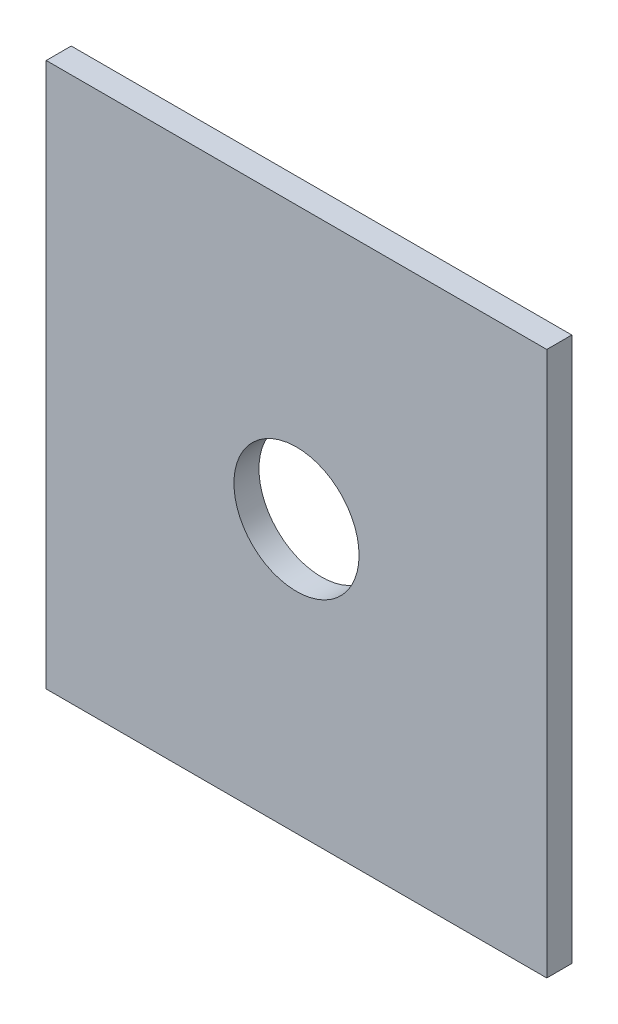
ISO-10303-21;
HEADER;
FILE_DESCRIPTION(('STEP AP214'),'2;1');
FILE_NAME('part.step','',(''),(''),'','','');
FILE_SCHEMA(('AUTOMOTIVE_DESIGN { 1 0 10303 214 1 1 1 1 }'));
ENDSEC;
DATA;
#1=APPLICATION_CONTEXT('core data for automotive mechanical design processes');
#2=APPLICATION_PROTOCOL_DEFINITION('international standard','automotive_design',2000,#1);
#3=PRODUCT_CONTEXT('',#1,'mechanical');
#4=PRODUCT('Part','Part','',(#3));
#5=PRODUCT_RELATED_PRODUCT_CATEGORY('part','',(#4));
#6=PRODUCT_DEFINITION_FORMATION('','',#4);
#7=PRODUCT_DEFINITION_CONTEXT('part definition',#1,'design');
#8=PRODUCT_DEFINITION('design','',#6,#7);
#9=PRODUCT_DEFINITION_SHAPE('','',#8);
#10=(LENGTH_UNIT() NAMED_UNIT(*) SI_UNIT(.MILLI.,.METRE.));
#11=(NAMED_UNIT(*) PLANE_ANGLE_UNIT() SI_UNIT($,.RADIAN.));
#12=(NAMED_UNIT(*) SI_UNIT($,.STERADIAN.) SOLID_ANGLE_UNIT());
#13=UNCERTAINTY_MEASURE_WITH_UNIT(LENGTH_MEASURE(1.E-05),#10,'distance_accuracy_value','');
#14=(GEOMETRIC_REPRESENTATION_CONTEXT(3) GLOBAL_UNCERTAINTY_ASSIGNED_CONTEXT((#13)) GLOBAL_UNIT_ASSIGNED_CONTEXT((#10,
#11,#12)) REPRESENTATION_CONTEXT('',''));
#15=CARTESIAN_POINT('',(0.,0.,0.));
#16=DIRECTION('',(0.,0.,1.));
#17=DIRECTION('',(1.,0.,0.));
#18=AXIS2_PLACEMENT_3D('',#15,#16,#17);
#19=CARTESIAN_POINT('',(0.,0.,2.));
#20=DIRECTION('',(1.,0.,0.));
#21=DIRECTION('',(0.,1.,0.));
#22=AXIS2_PLACEMENT_3D('',#19,#20,#21);
#23=PLANE('',#22);
#24=DIRECTION('',(0.,-1.,0.));
#25=VECTOR('',#24,1.);
#26=CARTESIAN_POINT('',(0.,0.,0.));
#27=LINE('',#26,#25);
#28=CARTESIAN_POINT('',(0.,0.,0.));
#29=VERTEX_POINT('',#28);
#30=CARTESIAN_POINT('',(0.,-43.5,0.));
#31=VERTEX_POINT('',#30);
#32=EDGE_CURVE('E101',#29,#31,#27,.T.);
#33=ORIENTED_EDGE('',*,*,#32,.T.);
#34=DIRECTION('',(0.,0.,-1.));
#35=VECTOR('',#34,1.);
#36=CARTESIAN_POINT('',(0.,-43.5,2.));
#37=LINE('',#36,#35);
#38=CARTESIAN_POINT('',(0.,-43.5,2.));
#39=VERTEX_POINT('',#38);
#40=EDGE_CURVE('E11',#39,#31,#37,.T.);
#41=ORIENTED_EDGE('',*,*,#40,.F.);
#42=DIRECTION('',(0.,-1.,0.));
#43=VECTOR('',#42,1.);
#44=CARTESIAN_POINT('',(0.,0.,2.));
#45=LINE('',#44,#43);
#46=CARTESIAN_POINT('',(0.,0.,2.));
#47=VERTEX_POINT('',#46);
#48=EDGE_CURVE('E89',#47,#39,#45,.T.);
#49=ORIENTED_EDGE('',*,*,#48,.F.);
#50=DIRECTION('',(0.,0.,-1.));
#51=VECTOR('',#50,1.);
#52=CARTESIAN_POINT('',(0.,0.,2.));
#53=LINE('',#52,#51);
#54=EDGE_CURVE('E97',#47,#29,#53,.T.);
#55=ORIENTED_EDGE('',*,*,#54,.T.);
#56=EDGE_LOOP('',(#33,#41,#49,#55));
#57=FACE_BOUND('',#56,.T.);
#58=ADVANCED_FACE('F38',(#57),#23,.F.);
#59=CARTESIAN_POINT('',(0.,-43.5,2.));
#60=DIRECTION('',(0.,1.,0.));
#61=DIRECTION('',(0.,0.,1.));
#62=AXIS2_PLACEMENT_3D('',#59,#60,#61);
#63=PLANE('',#62);
#64=DIRECTION('',(1.,0.,0.));
#65=VECTOR('',#64,1.);
#66=CARTESIAN_POINT('',(0.,-43.5,0.));
#67=LINE('',#66,#65);
#68=CARTESIAN_POINT('',(40.,-43.5,0.));
#69=VERTEX_POINT('',#68);
#70=EDGE_CURVE('E93',#31,#69,#67,.T.);
#71=ORIENTED_EDGE('',*,*,#70,.T.);
#72=DIRECTION('',(0.,0.,-1.));
#73=VECTOR('',#72,1.);
#74=CARTESIAN_POINT('',(40.,-43.5,2.));
#75=LINE('',#74,#73);
#76=CARTESIAN_POINT('',(40.,-43.5,2.));
#77=VERTEX_POINT('',#76);
#78=EDGE_CURVE('E46',#77,#69,#75,.T.);
#79=ORIENTED_EDGE('',*,*,#78,.F.);
#80=DIRECTION('',(1.,0.,0.));
#81=VECTOR('',#80,1.);
#82=CARTESIAN_POINT('',(0.,-43.5,2.));
#83=LINE('',#82,#81);
#84=EDGE_CURVE('E84',#39,#77,#83,.T.);
#85=ORIENTED_EDGE('',*,*,#84,.F.);
#86=ORIENTED_EDGE('',*,*,#40,.T.);
#87=EDGE_LOOP('',(#71,#79,#85,#86));
#88=FACE_BOUND('',#87,.T.);
#89=ADVANCED_FACE('F92',(#88),#63,.F.);
#90=CARTESIAN_POINT('',(40.,0.,2.));
#91=DIRECTION('',(-1.,0.,0.));
#92=DIRECTION('',(0.,-1.,0.));
#93=AXIS2_PLACEMENT_3D('',#90,#91,#92);
#94=PLANE('',#93);
#95=DIRECTION('',(0.,1.,0.));
#96=VECTOR('',#95,1.);
#97=CARTESIAN_POINT('',(40.,0.,0.));
#98=LINE('',#97,#96);
#99=CARTESIAN_POINT('',(40.,0.,0.));
#100=VERTEX_POINT('',#99);
#101=EDGE_CURVE('E71',#69,#100,#98,.T.);
#102=ORIENTED_EDGE('',*,*,#101,.T.);
#103=DIRECTION('',(0.,0.,-1.));
#104=VECTOR('',#103,1.);
#105=CARTESIAN_POINT('',(40.,0.,2.));
#106=LINE('',#105,#104);
#107=CARTESIAN_POINT('',(40.,0.,2.));
#108=VERTEX_POINT('',#107);
#109=EDGE_CURVE('E94',#108,#100,#106,.T.);
#110=ORIENTED_EDGE('',*,*,#109,.F.);
#111=DIRECTION('',(0.,1.,0.));
#112=VECTOR('',#111,1.);
#113=CARTESIAN_POINT('',(40.,0.,2.));
#114=LINE('',#113,#112);
#115=EDGE_CURVE('E87',#77,#108,#114,.T.);
#116=ORIENTED_EDGE('',*,*,#115,.F.);
#117=ORIENTED_EDGE('',*,*,#78,.T.);
#118=EDGE_LOOP('',(#102,#110,#116,#117));
#119=FACE_BOUND('',#118,.T.);
#120=ADVANCED_FACE('F95',(#119),#94,.F.);
#121=CARTESIAN_POINT('',(0.,0.,2.));
#122=DIRECTION('',(0.,-1.,0.));
#123=DIRECTION('',(0.,0.,-1.));
#124=AXIS2_PLACEMENT_3D('',#121,#122,#123);
#125=PLANE('',#124);
#126=DIRECTION('',(-1.,0.,0.));
#127=VECTOR('',#126,1.);
#128=CARTESIAN_POINT('',(0.,0.,0.));
#129=LINE('',#128,#127);
#130=EDGE_CURVE('E77',#100,#29,#129,.T.);
#131=ORIENTED_EDGE('',*,*,#130,.T.);
#132=ORIENTED_EDGE('',*,*,#54,.F.);
#133=DIRECTION('',(-1.,0.,0.));
#134=VECTOR('',#133,1.);
#135=CARTESIAN_POINT('',(0.,0.,2.));
#136=LINE('',#135,#134);
#137=EDGE_CURVE('E54',#108,#47,#136,.T.);
#138=ORIENTED_EDGE('',*,*,#137,.F.);
#139=ORIENTED_EDGE('',*,*,#109,.T.);
#140=EDGE_LOOP('',(#131,#132,#138,#139));
#141=FACE_BOUND('',#140,.T.);
#142=ADVANCED_FACE('F109',(#141),#125,.F.);
#143=CARTESIAN_POINT('',(0.,0.,2.));
#144=DIRECTION('',(0.,0.,1.));
#145=DIRECTION('',(1.,0.,0.));
#146=AXIS2_PLACEMENT_3D('',#143,#144,#145);
#147=PLANE('',#146);
#148=CARTESIAN_POINT('',(20.,-21.75,2.));
#149=DIRECTION('',(0.,0.,1.));
#150=DIRECTION('',(1.,0.,0.));
#151=AXIS2_PLACEMENT_3D('',#148,#149,#150);
#152=CIRCLE('',#151,5.);
#153=CARTESIAN_POINT('',(25.,-21.75,2.));
#154=VERTEX_POINT('',#153);
#155=EDGE_CURVE('E115',#154,#154,#152,.T.);
#156=ORIENTED_EDGE('',*,*,#155,.F.);
#157=EDGE_LOOP('',(#156));
#158=FACE_BOUND('',#157,.T.);
#159=ORIENTED_EDGE('',*,*,#48,.T.);
#160=ORIENTED_EDGE('',*,*,#84,.T.);
#161=ORIENTED_EDGE('',*,*,#115,.T.);
#162=ORIENTED_EDGE('',*,*,#137,.T.);
#163=EDGE_LOOP('',(#159,#160,#161,#162));
#164=FACE_BOUND('',#163,.T.);
#165=ADVANCED_FACE('F85',(#158,#164),#147,.T.);
#166=CARTESIAN_POINT('',(0.,0.,0.));
#167=DIRECTION('',(0.,0.,1.));
#168=DIRECTION('',(1.,0.,0.));
#169=AXIS2_PLACEMENT_3D('',#166,#167,#168);
#170=PLANE('',#169);
#171=CARTESIAN_POINT('',(20.,-21.75,0.));
#172=DIRECTION('',(0.,0.,1.));
#173=DIRECTION('',(1.,0.,0.));
#174=AXIS2_PLACEMENT_3D('',#171,#172,#173);
#175=CIRCLE('',#174,5.);
#176=CARTESIAN_POINT('',(25.,-21.75,0.));
#177=VERTEX_POINT('',#176);
#178=EDGE_CURVE('E104',#177,#177,#175,.T.);
#179=ORIENTED_EDGE('',*,*,#178,.T.);
#180=EDGE_LOOP('',(#179));
#181=FACE_BOUND('',#180,.T.);
#182=ORIENTED_EDGE('',*,*,#32,.F.);
#183=ORIENTED_EDGE('',*,*,#130,.F.);
#184=ORIENTED_EDGE('',*,*,#101,.F.);
#185=ORIENTED_EDGE('',*,*,#70,.F.);
#186=EDGE_LOOP('',(#182,#183,#184,#185));
#187=FACE_BOUND('',#186,.T.);
#188=ADVANCED_FACE('F112',(#181,#187),#170,.F.);
#189=CARTESIAN_POINT('',(20.,-21.75,0.));
#190=DIRECTION('',(0.,0.,1.));
#191=DIRECTION('',(1.,0.,0.));
#192=AXIS2_PLACEMENT_3D('',#189,#190,#191);
#193=CYLINDRICAL_SURFACE('',#192,5.);
#194=ORIENTED_EDGE('',*,*,#178,.F.);
#195=EDGE_LOOP('',(#194));
#196=FACE_BOUND('',#195,.T.);
#197=ORIENTED_EDGE('',*,*,#155,.T.);
#198=EDGE_LOOP('',(#197));
#199=FACE_BOUND('',#198,.T.);
#200=ADVANCED_FACE('F122',(#196,#199),#193,.F.);
#201=CLOSED_SHELL('',(#58,#89,#120,#142,#165,#188,#200));
#202=MANIFOLD_SOLID_BREP('B2',#201);
#203=ADVANCED_BREP_SHAPE_REPRESENTATION('',(#18,#202),#14);
#204=SHAPE_DEFINITION_REPRESENTATION(#9,#203);
ENDSEC;
END-ISO-10303-21;
